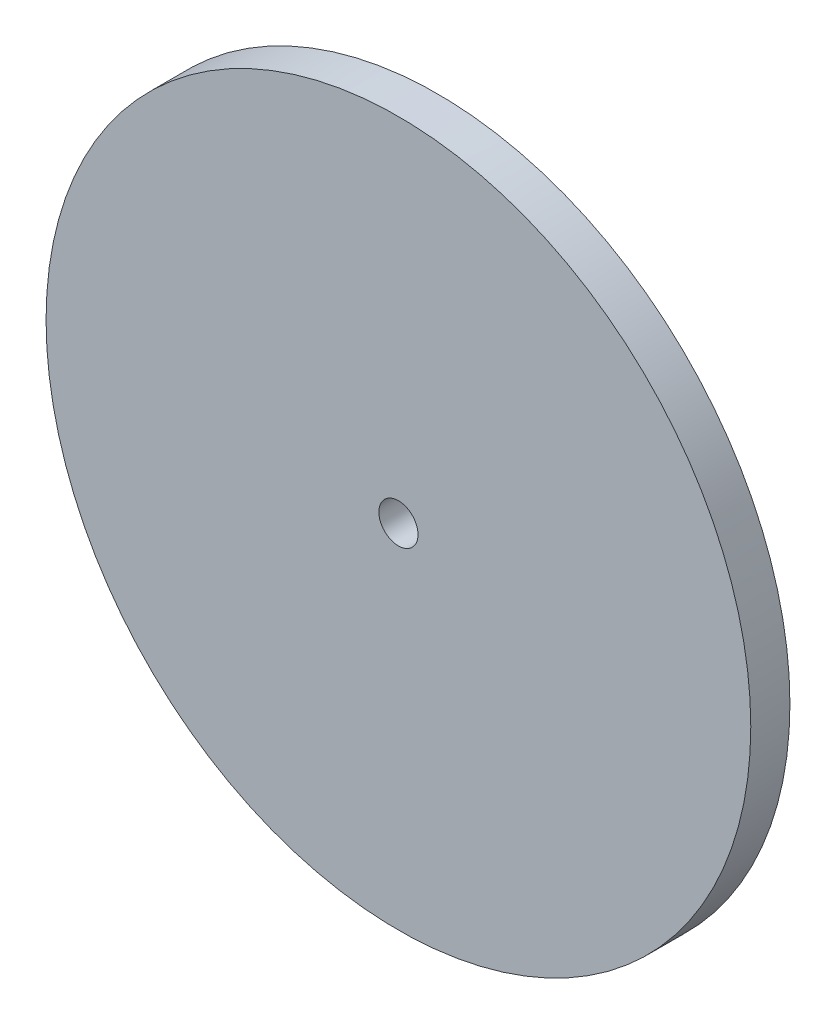
ISO-10303-21;
HEADER;
FILE_DESCRIPTION(('STEP AP214'),'2;1');
FILE_NAME('part.step','',(''),(''),'','','');
FILE_SCHEMA(('AUTOMOTIVE_DESIGN { 1 0 10303 214 1 1 1 1 }'));
ENDSEC;
DATA;
#1=APPLICATION_CONTEXT('core data for automotive mechanical design processes');
#2=APPLICATION_PROTOCOL_DEFINITION('international standard','automotive_design',2000,#1);
#3=PRODUCT_CONTEXT('',#1,'mechanical');
#4=PRODUCT('Part','Part','',(#3));
#5=PRODUCT_RELATED_PRODUCT_CATEGORY('part','',(#4));
#6=PRODUCT_DEFINITION_FORMATION('','',#4);
#7=PRODUCT_DEFINITION_CONTEXT('part definition',#1,'design');
#8=PRODUCT_DEFINITION('design','',#6,#7);
#9=PRODUCT_DEFINITION_SHAPE('','',#8);
#10=(LENGTH_UNIT() NAMED_UNIT(*) SI_UNIT(.MILLI.,.METRE.));
#11=(NAMED_UNIT(*) PLANE_ANGLE_UNIT() SI_UNIT($,.RADIAN.));
#12=(NAMED_UNIT(*) SI_UNIT($,.STERADIAN.) SOLID_ANGLE_UNIT());
#13=UNCERTAINTY_MEASURE_WITH_UNIT(LENGTH_MEASURE(1.E-05),#10,'distance_accuracy_value','');
#14=(GEOMETRIC_REPRESENTATION_CONTEXT(3) GLOBAL_UNCERTAINTY_ASSIGNED_CONTEXT((#13)) GLOBAL_UNIT_ASSIGNED_CONTEXT((#10,
#11,#12)) REPRESENTATION_CONTEXT('',''));
#15=CARTESIAN_POINT('',(0.,0.,0.));
#16=DIRECTION('',(0.,0.,1.));
#17=DIRECTION('',(1.,0.,0.));
#18=AXIS2_PLACEMENT_3D('',#15,#16,#17);
#19=CARTESIAN_POINT('',(0.,0.,5.));
#20=DIRECTION('',(0.,0.,1.));
#21=DIRECTION('',(1.,0.,0.));
#22=AXIS2_PLACEMENT_3D('',#19,#20,#21);
#23=PLANE('',#22);
#24=CARTESIAN_POINT('',(0.,0.,5.));
#25=DIRECTION('',(0.,0.,1.));
#26=DIRECTION('',(1.,0.,0.));
#27=AXIS2_PLACEMENT_3D('',#24,#25,#26);
#28=CIRCLE('',#27,45.);
#29=CARTESIAN_POINT('',(45.,0.,5.));
#30=VERTEX_POINT('',#29);
#31=EDGE_CURVE('E10',#30,#30,#28,.T.);
#32=ORIENTED_EDGE('',*,*,#31,.T.);
#33=EDGE_LOOP('',(#32));
#34=FACE_BOUND('',#33,.T.);
#35=CARTESIAN_POINT('',(0.,0.,5.));
#36=DIRECTION('',(0.,0.,1.));
#37=DIRECTION('',(1.,0.,0.));
#38=AXIS2_PLACEMENT_3D('',#35,#36,#37);
#39=CIRCLE('',#38,2.5);
#40=CARTESIAN_POINT('',(2.5,0.,5.));
#41=VERTEX_POINT('',#40);
#42=EDGE_CURVE('E41',#41,#41,#39,.T.);
#43=ORIENTED_EDGE('',*,*,#42,.F.);
#44=EDGE_LOOP('',(#43));
#45=FACE_BOUND('',#44,.T.);
#46=ADVANCED_FACE('F30',(#34,#45),#23,.T.);
#47=CARTESIAN_POINT('',(0.,0.,0.));
#48=DIRECTION('',(0.,0.,1.));
#49=DIRECTION('',(1.,0.,0.));
#50=AXIS2_PLACEMENT_3D('',#47,#48,#49);
#51=PLANE('',#50);
#52=CARTESIAN_POINT('',(0.,0.,0.));
#53=DIRECTION('',(0.,0.,1.));
#54=DIRECTION('',(1.,0.,0.));
#55=AXIS2_PLACEMENT_3D('',#52,#53,#54);
#56=CIRCLE('',#55,45.);
#57=CARTESIAN_POINT('',(45.,0.,0.));
#58=VERTEX_POINT('',#57);
#59=EDGE_CURVE('E34',#58,#58,#56,.T.);
#60=ORIENTED_EDGE('',*,*,#59,.F.);
#61=EDGE_LOOP('',(#60));
#62=FACE_BOUND('',#61,.T.);
#63=CARTESIAN_POINT('',(0.,0.,0.));
#64=DIRECTION('',(0.,0.,1.));
#65=DIRECTION('',(1.,0.,0.));
#66=AXIS2_PLACEMENT_3D('',#63,#64,#65);
#67=CIRCLE('',#66,2.5);
#68=CARTESIAN_POINT('',(2.5,0.,0.));
#69=VERTEX_POINT('',#68);
#70=EDGE_CURVE('E43',#69,#69,#67,.T.);
#71=ORIENTED_EDGE('',*,*,#70,.T.);
#72=EDGE_LOOP('',(#71));
#73=FACE_BOUND('',#72,.T.);
#74=ADVANCED_FACE('F53',(#62,#73),#51,.F.);
#75=CARTESIAN_POINT('',(0.,0.,5.));
#76=DIRECTION('',(0.,0.,-1.));
#77=DIRECTION('',(-1.,0.,0.));
#78=AXIS2_PLACEMENT_3D('',#75,#76,#77);
#79=CYLINDRICAL_SURFACE('',#78,45.);
#80=ORIENTED_EDGE('',*,*,#31,.F.);
#81=EDGE_LOOP('',(#80));
#82=FACE_BOUND('',#81,.T.);
#83=ORIENTED_EDGE('',*,*,#59,.T.);
#84=EDGE_LOOP('',(#83));
#85=FACE_BOUND('',#84,.T.);
#86=ADVANCED_FACE('F32',(#82,#85),#79,.T.);
#87=CARTESIAN_POINT('',(0.,0.,5.));
#88=DIRECTION('',(0.,0.,-1.));
#89=DIRECTION('',(-1.,0.,0.));
#90=AXIS2_PLACEMENT_3D('',#87,#88,#89);
#91=CYLINDRICAL_SURFACE('',#90,2.5);
#92=ORIENTED_EDGE('',*,*,#42,.T.);
#93=EDGE_LOOP('',(#92));
#94=FACE_BOUND('',#93,.T.);
#95=ORIENTED_EDGE('',*,*,#70,.F.);
#96=EDGE_LOOP('',(#95));
#97=FACE_BOUND('',#96,.T.);
#98=ADVANCED_FACE('F49',(#94,#97),#91,.F.);
#99=CLOSED_SHELL('',(#46,#74,#86,#98));
#100=MANIFOLD_SOLID_BREP('B2',#99);
#101=ADVANCED_BREP_SHAPE_REPRESENTATION('',(#18,#100),#14);
#102=SHAPE_DEFINITION_REPRESENTATION(#9,#101);
ENDSEC;
END-ISO-10303-21;
